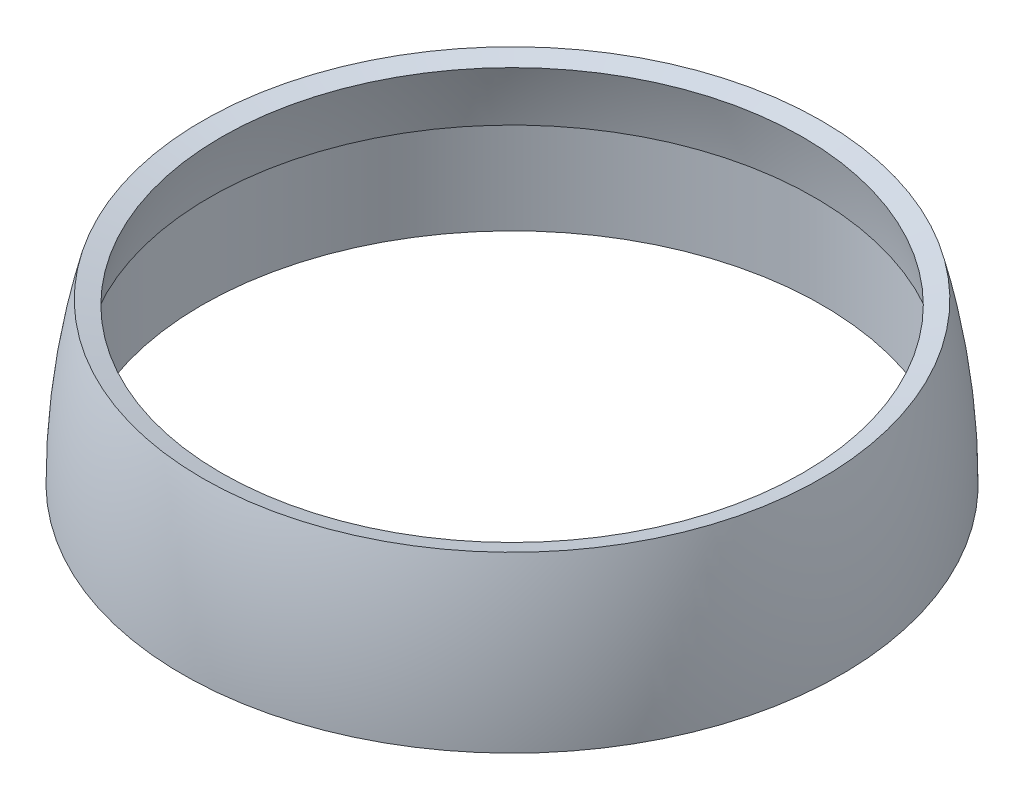
ISO-10303-21;
HEADER;
FILE_DESCRIPTION(('STEP AP214'),'2;1');
FILE_NAME('part.step','',(''),(''),'','','');
FILE_SCHEMA(('AUTOMOTIVE_DESIGN { 1 0 10303 214 1 1 1 1 }'));
ENDSEC;
DATA;
#1=APPLICATION_CONTEXT('core data for automotive mechanical design processes');
#2=APPLICATION_PROTOCOL_DEFINITION('international standard','automotive_design',2000,#1);
#3=PRODUCT_CONTEXT('',#1,'mechanical');
#4=PRODUCT('Part','Part','',(#3));
#5=PRODUCT_RELATED_PRODUCT_CATEGORY('part','',(#4));
#6=PRODUCT_DEFINITION_FORMATION('','',#4);
#7=PRODUCT_DEFINITION_CONTEXT('part definition',#1,'design');
#8=PRODUCT_DEFINITION('design','',#6,#7);
#9=PRODUCT_DEFINITION_SHAPE('','',#8);
#10=(LENGTH_UNIT() NAMED_UNIT(*) SI_UNIT(.MILLI.,.METRE.));
#11=(NAMED_UNIT(*) PLANE_ANGLE_UNIT() SI_UNIT($,.RADIAN.));
#12=(NAMED_UNIT(*) SI_UNIT($,.STERADIAN.) SOLID_ANGLE_UNIT());
#13=UNCERTAINTY_MEASURE_WITH_UNIT(LENGTH_MEASURE(1.E-05),#10,'distance_accuracy_value','');
#14=(GEOMETRIC_REPRESENTATION_CONTEXT(3) GLOBAL_UNCERTAINTY_ASSIGNED_CONTEXT((#13)) GLOBAL_UNIT_ASSIGNED_CONTEXT((#10,
#11,#12)) REPRESENTATION_CONTEXT('',''));
#15=CARTESIAN_POINT('',(0.,0.,0.));
#16=DIRECTION('',(0.,0.,1.));
#17=DIRECTION('',(1.,0.,0.));
#18=AXIS2_PLACEMENT_3D('',#15,#16,#17);
#19=CARTESIAN_POINT('',(0.,0.,0.));
#20=DIRECTION('',(0.,-1.,0.));
#21=DIRECTION('',(0.,0.,-1.));
#22=AXIS2_PLACEMENT_3D('',#19,#20,#21);
#23=DEGENERATE_TOROIDAL_SURFACE('',#22,16.5,32.5,.F.);
#24=CARTESIAN_POINT('',(0.,8.,0.));
#25=DIRECTION('',(0.,-1.,0.));
#26=DIRECTION('',(0.,0.,-1.));
#27=AXIS2_PLACEMENT_3D('',#24,#25,#26);
#28=CIRCLE('',#27,15.);
#29=CARTESIAN_POINT('',(0.,8.,-15.));
#30=VERTEX_POINT('',#29);
#31=EDGE_CURVE('E10',#30,#30,#28,.T.);
#32=ORIENTED_EDGE('',*,*,#31,.F.);
#33=EDGE_LOOP('',(#32));
#34=FACE_BOUND('',#33,.T.);
#35=CARTESIAN_POINT('',(0.,5.,0.));
#36=DIRECTION('',(0.,-1.,0.));
#37=DIRECTION('',(1.,0.,0.));
#38=AXIS2_PLACEMENT_3D('',#35,#36,#37);
#39=CIRCLE('',#38,15.6130814466628);
#40=CARTESIAN_POINT('',(15.6130814466628,5.,0.));
#41=VERTEX_POINT('',#40);
#42=EDGE_CURVE('E33',#41,#41,#39,.T.);
#43=ORIENTED_EDGE('',*,*,#42,.T.);
#44=EDGE_LOOP('',(#43));
#45=FACE_BOUND('',#44,.T.);
#46=ADVANCED_FACE('F30',(#34,#45),#23,.T.);
#47=CARTESIAN_POINT('',(0.,8.,0.));
#48=DIRECTION('',(0.,1.,0.));
#49=DIRECTION('',(0.,0.,1.));
#50=AXIS2_PLACEMENT_3D('',#47,#48,#49);
#51=CONICAL_SURFACE('',#50,15.,1.32208633770137);
#52=CARTESIAN_POINT('',(0.,8.24615384615385,0.));
#53=DIRECTION('',(0.,-1.,0.));
#54=DIRECTION('',(0.,0.,-1.));
#55=AXIS2_PLACEMENT_3D('',#52,#53,#54);
#56=CIRCLE('',#55,15.9692307692308);
#57=CARTESIAN_POINT('',(0.,8.24615384615385,-15.9692307692308));
#58=VERTEX_POINT('',#57);
#59=EDGE_CURVE('E37',#58,#58,#56,.T.);
#60=ORIENTED_EDGE('',*,*,#59,.F.);
#61=EDGE_LOOP('',(#60));
#62=FACE_BOUND('',#61,.T.);
#63=ORIENTED_EDGE('',*,*,#31,.T.);
#64=EDGE_LOOP('',(#63));
#65=FACE_BOUND('',#64,.T.);
#66=ADVANCED_FACE('F67',(#62,#65),#51,.F.);
#67=CARTESIAN_POINT('',(0.,0.,0.));
#68=DIRECTION('',(0.,-1.,0.));
#69=DIRECTION('',(0.,0.,-1.));
#70=AXIS2_PLACEMENT_3D('',#67,#68,#69);
#71=DEGENERATE_TOROIDAL_SURFACE('',#70,16.5,33.5,.F.);
#72=CARTESIAN_POINT('',(0.,0.,0.));
#73=DIRECTION('',(0.,-1.,0.));
#74=DIRECTION('',(0.,0.,-1.));
#75=AXIS2_PLACEMENT_3D('',#72,#73,#74);
#76=CIRCLE('',#75,17.);
#77=CARTESIAN_POINT('',(0.,0.,-17.));
#78=VERTEX_POINT('',#77);
#79=EDGE_CURVE('E41',#78,#78,#76,.T.);
#80=ORIENTED_EDGE('',*,*,#79,.F.);
#81=EDGE_LOOP('',(#80));
#82=FACE_BOUND('',#81,.T.);
#83=ORIENTED_EDGE('',*,*,#59,.T.);
#84=EDGE_LOOP('',(#83));
#85=FACE_BOUND('',#84,.T.);
#86=ADVANCED_FACE('F72',(#82,#85),#71,.F.);
#87=CARTESIAN_POINT('',(17.,0.,0.));
#88=DIRECTION('',(0.,1.,0.));
#89=DIRECTION('',(0.,0.,1.));
#90=AXIS2_PLACEMENT_3D('',#87,#88,#89);
#91=PLANE('',#90);
#92=CARTESIAN_POINT('',(0.,0.,0.));
#93=DIRECTION('',(0.,1.,0.));
#94=DIRECTION('',(-1.,0.,0.));
#95=AXIS2_PLACEMENT_3D('',#92,#93,#94);
#96=CIRCLE('',#95,16.);
#97=CARTESIAN_POINT('',(-16.,0.,0.));
#98=VERTEX_POINT('',#97);
#99=EDGE_CURVE('E49',#98,#98,#96,.T.);
#100=ORIENTED_EDGE('',*,*,#99,.T.);
#101=EDGE_LOOP('',(#100));
#102=FACE_BOUND('',#101,.T.);
#103=ORIENTED_EDGE('',*,*,#79,.T.);
#104=EDGE_LOOP('',(#103));
#105=FACE_BOUND('',#104,.T.);
#106=ADVANCED_FACE('F53',(#102,#105),#91,.F.);
#107=CARTESIAN_POINT('',(16.,5.,0.));
#108=DIRECTION('',(0.,-1.,0.));
#109=DIRECTION('',(1.,0.,0.));
#110=AXIS2_PLACEMENT_3D('',#107,#108,#109);
#111=PLANE('',#110);
#112=ORIENTED_EDGE('',*,*,#42,.F.);
#113=EDGE_LOOP('',(#112));
#114=FACE_BOUND('',#113,.T.);
#115=CARTESIAN_POINT('',(0.,5.,0.));
#116=DIRECTION('',(0.,1.,0.));
#117=DIRECTION('',(-1.,0.,0.));
#118=AXIS2_PLACEMENT_3D('',#115,#116,#117);
#119=CIRCLE('',#118,16.);
#120=CARTESIAN_POINT('',(-16.,5.,0.));
#121=VERTEX_POINT('',#120);
#122=EDGE_CURVE('E46',#121,#121,#119,.T.);
#123=ORIENTED_EDGE('',*,*,#122,.F.);
#124=EDGE_LOOP('',(#123));
#125=FACE_BOUND('',#124,.T.);
#126=ADVANCED_FACE('F58',(#114,#125),#111,.T.);
#127=CARTESIAN_POINT('',(0.,5.,0.));
#128=DIRECTION('',(0.,1.,0.));
#129=DIRECTION('',(-1.,0.,0.));
#130=AXIS2_PLACEMENT_3D('',#127,#128,#129);
#131=CYLINDRICAL_SURFACE('',#130,16.);
#132=ORIENTED_EDGE('',*,*,#122,.T.);
#133=EDGE_LOOP('',(#132));
#134=FACE_BOUND('',#133,.T.);
#135=ORIENTED_EDGE('',*,*,#99,.F.);
#136=EDGE_LOOP('',(#135));
#137=FACE_BOUND('',#136,.T.);
#138=ADVANCED_FACE('F56',(#134,#137),#131,.F.);
#139=CLOSED_SHELL('',(#46,#66,#86,#106,#126,#138));
#140=MANIFOLD_SOLID_BREP('B2',#139);
#141=ADVANCED_BREP_SHAPE_REPRESENTATION('',(#18,#140),#14);
#142=SHAPE_DEFINITION_REPRESENTATION(#9,#141);
ENDSEC;
END-ISO-10303-21;
